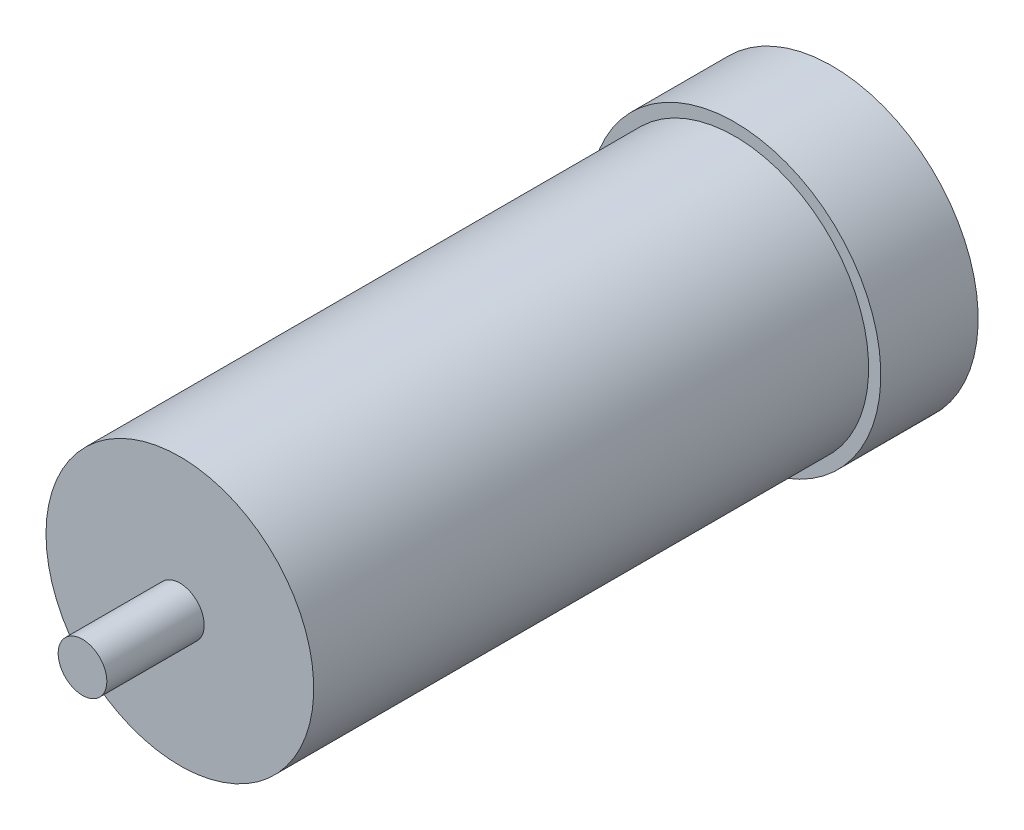
ISO-10303-21;
HEADER;
FILE_DESCRIPTION(('STEP AP214'),'2;1');
FILE_NAME('part.step','',(''),(''),'','','');
FILE_SCHEMA(('AUTOMOTIVE_DESIGN { 1 0 10303 214 1 1 1 1 }'));
ENDSEC;
DATA;
#1=APPLICATION_CONTEXT('core data for automotive mechanical design processes');
#2=APPLICATION_PROTOCOL_DEFINITION('international standard','automotive_design',2000,#1);
#3=PRODUCT_CONTEXT('',#1,'mechanical');
#4=PRODUCT('Part','Part','',(#3));
#5=PRODUCT_RELATED_PRODUCT_CATEGORY('part','',(#4));
#6=PRODUCT_DEFINITION_FORMATION('','',#4);
#7=PRODUCT_DEFINITION_CONTEXT('part definition',#1,'design');
#8=PRODUCT_DEFINITION('design','',#6,#7);
#9=PRODUCT_DEFINITION_SHAPE('','',#8);
#10=(LENGTH_UNIT() NAMED_UNIT(*) SI_UNIT(.MILLI.,.METRE.));
#11=(NAMED_UNIT(*) PLANE_ANGLE_UNIT() SI_UNIT($,.RADIAN.));
#12=(NAMED_UNIT(*) SI_UNIT($,.STERADIAN.) SOLID_ANGLE_UNIT());
#13=UNCERTAINTY_MEASURE_WITH_UNIT(LENGTH_MEASURE(1.E-05),#10,'distance_accuracy_value','');
#14=(GEOMETRIC_REPRESENTATION_CONTEXT(3) GLOBAL_UNCERTAINTY_ASSIGNED_CONTEXT((#13)) GLOBAL_UNIT_ASSIGNED_CONTEXT((#10,
#11,#12)) REPRESENTATION_CONTEXT('',''));
#15=CARTESIAN_POINT('',(0.,0.,0.));
#16=DIRECTION('',(0.,0.,1.));
#17=DIRECTION('',(1.,0.,0.));
#18=AXIS2_PLACEMENT_3D('',#15,#16,#17);
#19=CARTESIAN_POINT('',(0.,0.,28.5));
#20=DIRECTION('',(0.,0.,-1.));
#21=DIRECTION('',(-1.,0.,0.));
#22=AXIS2_PLACEMENT_3D('',#19,#20,#21);
#23=CYLINDRICAL_SURFACE('',#22,6.875);
#24=CARTESIAN_POINT('',(0.,0.,28.5));
#25=DIRECTION('',(0.,0.,1.));
#26=DIRECTION('',(1.,0.,0.));
#27=AXIS2_PLACEMENT_3D('',#24,#25,#26);
#28=CIRCLE('',#27,6.875);
#29=CARTESIAN_POINT('',(-6.875,0.,28.5));
#30=VERTEX_POINT('',#29);
#31=EDGE_CURVE('E40',#30,#30,#28,.T.);
#32=CARTESIAN_POINT('',(0.,0.,0.));
#33=DIRECTION('',(0.,0.,1.));
#34=DIRECTION('',(1.,0.,0.));
#35=AXIS2_PLACEMENT_3D('',#32,#33,#34);
#36=CIRCLE('',#35,6.875);
#37=CARTESIAN_POINT('',(-6.875,0.,0.));
#38=VERTEX_POINT('',#37);
#39=EDGE_CURVE('E36',#38,#38,#36,.T.);
#40=CARTESIAN_POINT('',(-6.875,0.,28.5));
#41=CARTESIAN_POINT('',(-6.875,0.,28.203125));
#42=CARTESIAN_POINT('',(-6.875,0.,27.90625));
#43=CARTESIAN_POINT('',(-6.875,0.,27.3125));
#44=CARTESIAN_POINT('',(-6.875,0.,27.015625));
#45=CARTESIAN_POINT('',(-6.875,0.,26.421875));
#46=CARTESIAN_POINT('',(-6.875,0.,26.125));
#47=CARTESIAN_POINT('',(-6.875,0.,25.53125));
#48=CARTESIAN_POINT('',(-6.875,0.,25.234375));
#49=CARTESIAN_POINT('',(-6.875,0.,24.640625));
#50=CARTESIAN_POINT('',(-6.875,0.,24.34375));
#51=CARTESIAN_POINT('',(-6.875,0.,23.75));
#52=CARTESIAN_POINT('',(-6.875,0.,23.453125));
#53=CARTESIAN_POINT('',(-6.875,0.,22.859375));
#54=CARTESIAN_POINT('',(-6.875,0.,22.5625));
#55=CARTESIAN_POINT('',(-6.875,0.,21.96875));
#56=CARTESIAN_POINT('',(-6.875,0.,21.671875));
#57=CARTESIAN_POINT('',(-6.875,0.,21.078125));
#58=CARTESIAN_POINT('',(-6.875,0.,20.78125));
#59=CARTESIAN_POINT('',(-6.875,0.,20.1875));
#60=CARTESIAN_POINT('',(-6.875,0.,19.890625));
#61=CARTESIAN_POINT('',(-6.875,0.,19.296875));
#62=CARTESIAN_POINT('',(-6.875,0.,19.));
#63=CARTESIAN_POINT('',(-6.875,0.,18.40625));
#64=CARTESIAN_POINT('',(-6.875,0.,18.109375));
#65=CARTESIAN_POINT('',(-6.875,0.,17.515625));
#66=CARTESIAN_POINT('',(-6.875,0.,17.21875));
#67=CARTESIAN_POINT('',(-6.875,0.,16.625));
#68=CARTESIAN_POINT('',(-6.875,0.,16.328125));
#69=CARTESIAN_POINT('',(-6.875,0.,15.734375));
#70=CARTESIAN_POINT('',(-6.875,0.,15.4375));
#71=CARTESIAN_POINT('',(-6.875,0.,14.84375));
#72=CARTESIAN_POINT('',(-6.875,0.,14.546875));
#73=CARTESIAN_POINT('',(-6.875,0.,13.953125));
#74=CARTESIAN_POINT('',(-6.875,0.,13.65625));
#75=CARTESIAN_POINT('',(-6.875,0.,13.0625));
#76=CARTESIAN_POINT('',(-6.875,0.,12.765625));
#77=CARTESIAN_POINT('',(-6.875,0.,12.171875));
#78=CARTESIAN_POINT('',(-6.875,0.,11.875));
#79=CARTESIAN_POINT('',(-6.875,0.,11.28125));
#80=CARTESIAN_POINT('',(-6.875,0.,10.984375));
#81=CARTESIAN_POINT('',(-6.875,0.,10.390625));
#82=CARTESIAN_POINT('',(-6.875,0.,10.09375));
#83=CARTESIAN_POINT('',(-6.875,0.,9.5));
#84=CARTESIAN_POINT('',(-6.875,0.,9.203125));
#85=CARTESIAN_POINT('',(-6.875,0.,8.609375));
#86=CARTESIAN_POINT('',(-6.875,0.,8.3125));
#87=CARTESIAN_POINT('',(-6.875,0.,7.71875));
#88=CARTESIAN_POINT('',(-6.875,0.,7.421875));
#89=CARTESIAN_POINT('',(-6.875,0.,6.828125));
#90=CARTESIAN_POINT('',(-6.875,0.,6.53125));
#91=CARTESIAN_POINT('',(-6.875,0.,5.9375));
#92=CARTESIAN_POINT('',(-6.875,0.,5.640625));
#93=CARTESIAN_POINT('',(-6.875,0.,5.046875));
#94=CARTESIAN_POINT('',(-6.875,0.,4.75));
#95=CARTESIAN_POINT('',(-6.875,0.,4.15625));
#96=CARTESIAN_POINT('',(-6.875,0.,3.859375));
#97=CARTESIAN_POINT('',(-6.875,0.,3.265625));
#98=CARTESIAN_POINT('',(-6.875,0.,2.96875));
#99=CARTESIAN_POINT('',(-6.875,0.,2.375));
#100=CARTESIAN_POINT('',(-6.875,0.,2.078125));
#101=CARTESIAN_POINT('',(-6.875,0.,1.484375));
#102=CARTESIAN_POINT('',(-6.875,0.,1.1875));
#103=CARTESIAN_POINT('',(-6.875,0.,0.593749999999999));
#104=CARTESIAN_POINT('',(-6.875,0.,0.296875));
#105=CARTESIAN_POINT('',(-6.875,0.,0.));
#106=B_SPLINE_CURVE_WITH_KNOTS('',3,(#40,#41,#42,#43,#44,#45,#46,#47,#48,#49,#50,#51,#52,#53,
#54,#55,#56,#57,#58,#59,#60,#61,#62,#63,#64,#65,#66,#67,#68,#69,#70,#71,#72,#73,#74,#75,#76,#77,
#78,#79,#80,#81,#82,#83,#84,#85,#86,#87,#88,#89,#90,#91,#92,#93,#94,#95,#96,#97,#98,#99,#100,
#101,#102,#103,#104,#105),.UNSPECIFIED.,.F.,.F.,(4,2,2,2,2,2,2,2,2,2,2,2,2,2,2,2,2,2,2,2,2,2,2,
2,2,2,2,2,2,2,2,2,4),(0.,0.890625000000003,1.78125,2.671875,3.5625,4.453125,5.34375,6.234375,
7.125,8.015625,8.90625,9.796875,10.6875,11.578125,12.46875,13.359375,14.25,15.140625,16.03125,
16.921875,17.8125,18.703125,19.59375,20.484375,21.375,22.265625,23.15625,24.046875,24.9375,
25.828125,26.71875,27.609375,28.5),.UNSPECIFIED.);
#107=EDGE_CURVE('BSEAM33',#30,#38,#106,.T.);
#108=ORIENTED_EDGE('',*,*,#31,.F.);
#109=ORIENTED_EDGE('',*,*,#39,.T.);
#110=ORIENTED_EDGE('',*,*,#107,.T.);
#111=ORIENTED_EDGE('',*,*,#107,.F.);
#112=EDGE_LOOP('',(#108,#110,#109,#111));
#113=FACE_BOUND('',#112,.T.);
#114=ADVANCED_FACE('F33',(#113),#23,.T.);
#115=CARTESIAN_POINT('',(0.,0.,28.5));
#116=DIRECTION('',(0.,0.,1.));
#117=DIRECTION('',(1.,0.,0.));
#118=AXIS2_PLACEMENT_3D('',#115,#116,#117);
#119=PLANE('',#118);
#120=CARTESIAN_POINT('',(0.,0.,28.5));
#121=DIRECTION('',(0.,0.,1.));
#122=DIRECTION('',(1.,0.,0.));
#123=AXIS2_PLACEMENT_3D('',#120,#121,#122);
#124=CIRCLE('',#123,1.25);
#125=CARTESIAN_POINT('',(1.25,0.,28.5));
#126=VERTEX_POINT('',#125);
#127=EDGE_CURVE('E10',#126,#126,#124,.T.);
#128=ORIENTED_EDGE('',*,*,#127,.F.);
#129=EDGE_LOOP('',(#128));
#130=FACE_BOUND('',#129,.T.);
#131=ORIENTED_EDGE('',*,*,#31,.T.);
#132=EDGE_LOOP('',(#131));
#133=FACE_BOUND('',#132,.T.);
#134=ADVANCED_FACE('F74',(#130,#133),#119,.T.);
#135=CARTESIAN_POINT('',(0.,0.,-5.));
#136=DIRECTION('',(0.,0.,1.));
#137=DIRECTION('',(1.,0.,0.));
#138=AXIS2_PLACEMENT_3D('',#135,#136,#137);
#139=CYLINDRICAL_SURFACE('',#138,7.5);
#140=CARTESIAN_POINT('',(0.,0.,-5.));
#141=DIRECTION('',(0.,0.,-1.));
#142=DIRECTION('',(-1.,0.,0.));
#143=AXIS2_PLACEMENT_3D('',#140,#141,#142);
#144=CIRCLE('',#143,7.5);
#145=CARTESIAN_POINT('',(-7.5,0.,-5.));
#146=VERTEX_POINT('',#145);
#147=EDGE_CURVE('E48',#146,#146,#144,.T.);
#148=ORIENTED_EDGE('',*,*,#147,.F.);
#149=EDGE_LOOP('',(#148));
#150=FACE_BOUND('',#149,.T.);
#151=CARTESIAN_POINT('',(0.,0.,0.));
#152=DIRECTION('',(0.,0.,-1.));
#153=DIRECTION('',(-1.,0.,0.));
#154=AXIS2_PLACEMENT_3D('',#151,#152,#153);
#155=CIRCLE('',#154,7.5);
#156=CARTESIAN_POINT('',(-7.5,0.,0.));
#157=VERTEX_POINT('',#156);
#158=EDGE_CURVE('E51',#157,#157,#155,.T.);
#159=ORIENTED_EDGE('',*,*,#158,.T.);
#160=EDGE_LOOP('',(#159));
#161=FACE_BOUND('',#160,.T.);
#162=ADVANCED_FACE('F79',(#150,#161),#139,.T.);
#163=CARTESIAN_POINT('',(0.,0.,-5.));
#164=DIRECTION('',(0.,0.,-1.));
#165=DIRECTION('',(-1.,0.,0.));
#166=AXIS2_PLACEMENT_3D('',#163,#164,#165);
#167=PLANE('',#166);
#168=ORIENTED_EDGE('',*,*,#147,.T.);
#169=EDGE_LOOP('',(#168));
#170=FACE_BOUND('',#169,.T.);
#171=ADVANCED_FACE('F69',(#170),#167,.T.);
#172=CARTESIAN_POINT('',(0.,0.,0.));
#173=DIRECTION('',(0.,0.,-1.));
#174=DIRECTION('',(-1.,0.,0.));
#175=AXIS2_PLACEMENT_3D('',#172,#173,#174);
#176=PLANE('',#175);
#177=ORIENTED_EDGE('',*,*,#39,.F.);
#178=EDGE_LOOP('',(#177));
#179=FACE_BOUND('',#178,.T.);
#180=ORIENTED_EDGE('',*,*,#158,.F.);
#181=EDGE_LOOP('',(#180));
#182=FACE_BOUND('',#181,.T.);
#183=ADVANCED_FACE('F62',(#179,#182),#176,.F.);
#184=CARTESIAN_POINT('',(0.,0.,33.5));
#185=DIRECTION('',(0.,0.,-1.));
#186=DIRECTION('',(-1.,0.,0.));
#187=AXIS2_PLACEMENT_3D('',#184,#185,#186);
#188=CYLINDRICAL_SURFACE('',#187,1.25);
#189=CARTESIAN_POINT('',(0.,0.,33.5));
#190=DIRECTION('',(0.,0.,1.));
#191=DIRECTION('',(1.,0.,0.));
#192=AXIS2_PLACEMENT_3D('',#189,#190,#191);
#193=CIRCLE('',#192,1.25);
#194=CARTESIAN_POINT('',(1.25,0.,33.5));
#195=VERTEX_POINT('',#194);
#196=EDGE_CURVE('E47',#195,#195,#193,.T.);
#197=ORIENTED_EDGE('',*,*,#196,.F.);
#198=EDGE_LOOP('',(#197));
#199=FACE_BOUND('',#198,.T.);
#200=ORIENTED_EDGE('',*,*,#127,.T.);
#201=EDGE_LOOP('',(#200));
#202=FACE_BOUND('',#201,.T.);
#203=ADVANCED_FACE('F60',(#199,#202),#188,.T.);
#204=CARTESIAN_POINT('',(0.,0.,33.5));
#205=DIRECTION('',(0.,0.,1.));
#206=DIRECTION('',(1.,0.,0.));
#207=AXIS2_PLACEMENT_3D('',#204,#205,#206);
#208=PLANE('',#207);
#209=ORIENTED_EDGE('',*,*,#196,.T.);
#210=EDGE_LOOP('',(#209));
#211=FACE_BOUND('',#210,.T.);
#212=ADVANCED_FACE('F58',(#211),#208,.T.);
#213=CLOSED_SHELL('',(#114,#134,#162,#171,#183,#203,#212));
#214=MANIFOLD_SOLID_BREP('B2',#213);
#215=ADVANCED_BREP_SHAPE_REPRESENTATION('',(#18,#214),#14);
#216=SHAPE_DEFINITION_REPRESENTATION(#9,#215);
ENDSEC;
END-ISO-10303-21;
